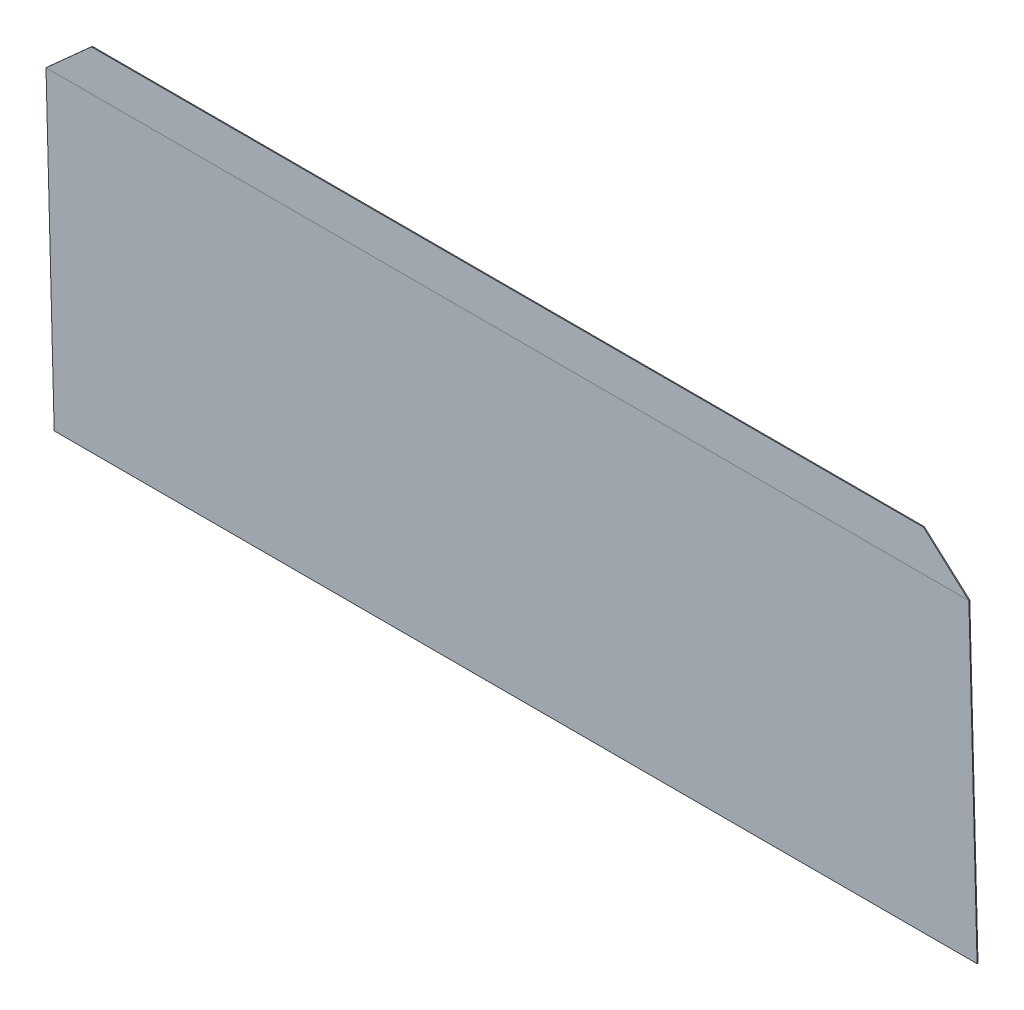
ISO-10303-21;
HEADER;
FILE_DESCRIPTION(('STEP AP214'),'2;1');
FILE_NAME('part.step','',(''),(''),'','','');
FILE_SCHEMA(('AUTOMOTIVE_DESIGN { 1 0 10303 214 1 1 1 1 }'));
ENDSEC;
DATA;
#1=APPLICATION_CONTEXT('core data for automotive mechanical design processes');
#2=APPLICATION_PROTOCOL_DEFINITION('international standard','automotive_design',2000,#1);
#3=PRODUCT_CONTEXT('',#1,'mechanical');
#4=PRODUCT('Part','Part','',(#3));
#5=PRODUCT_RELATED_PRODUCT_CATEGORY('part','',(#4));
#6=PRODUCT_DEFINITION_FORMATION('','',#4);
#7=PRODUCT_DEFINITION_CONTEXT('part definition',#1,'design');
#8=PRODUCT_DEFINITION('design','',#6,#7);
#9=PRODUCT_DEFINITION_SHAPE('','',#8);
#10=(LENGTH_UNIT() NAMED_UNIT(*) SI_UNIT(.MILLI.,.METRE.));
#11=(NAMED_UNIT(*) PLANE_ANGLE_UNIT() SI_UNIT($,.RADIAN.));
#12=(NAMED_UNIT(*) SI_UNIT($,.STERADIAN.) SOLID_ANGLE_UNIT());
#13=UNCERTAINTY_MEASURE_WITH_UNIT(LENGTH_MEASURE(1.E-05),#10,'distance_accuracy_value','');
#14=(GEOMETRIC_REPRESENTATION_CONTEXT(3) GLOBAL_UNCERTAINTY_ASSIGNED_CONTEXT((#13)) GLOBAL_UNIT_ASSIGNED_CONTEXT((#10,
#11,#12)) REPRESENTATION_CONTEXT('',''));
#15=CARTESIAN_POINT('',(0.,0.,0.));
#16=DIRECTION('',(0.,0.,1.));
#17=DIRECTION('',(1.,0.,0.));
#18=AXIS2_PLACEMENT_3D('',#15,#16,#17);
#19=CARTESIAN_POINT('',(996.,147.822198249311,3.36511894805777));
#20=DIRECTION('',(-1.,0.,0.));
#21=DIRECTION('',(0.,0.,1.));
#22=AXIS2_PLACEMENT_3D('',#19,#20,#21);
#23=CYLINDRICAL_SURFACE('',#22,1.);
#24=DIRECTION('',(-1.,0.,0.));
#25=VECTOR('',#24,1.);
#26=CARTESIAN_POINT('',(996.,147.79649246084,4.36478849967924));
#27=LINE('',#26,#25);
#28=CARTESIAN_POINT('',(996.,147.79649246084,4.36478849967927));
#29=VERTEX_POINT('',#28);
#30=CARTESIAN_POINT('',(0.,147.79649246084,4.36478849967924));
#31=VERTEX_POINT('',#30);
#32=EDGE_CURVE('E118',#29,#31,#27,.T.);
#33=ORIENTED_EDGE('',*,*,#32,.T.);
#34=CARTESIAN_POINT('',(-1.11022302462516E-13,147.79649246084,4.36478849967927));
#35=CARTESIAN_POINT('',(0.00238577729265074,147.79756329938,4.36481603553381));
#36=CARTESIAN_POINT('',(0.00477155458541177,147.798634182164,4.36484185076448));
#37=CARTESIAN_POINT('',(0.00954310917089681,147.800776025162,4.36489003973951));
#38=CARTESIAN_POINT('',(0.0119288864636208,147.801846985375,4.36491241348386));
#39=CARTESIAN_POINT('',(0.0167004410490676,147.803988972172,4.36495371924769));
#40=CARTESIAN_POINT('',(0.0190862183417904,147.805059998755,4.36497265126716));
#41=CARTESIAN_POINT('',(0.023857772927237,147.807202107231,4.36500707338775));
#42=CARTESIAN_POINT('',(0.0262435502199609,147.808273189123,4.36502256348887));
#43=CARTESIAN_POINT('',(0.0310151048054457,147.810415397156,4.3650501016121));
#44=CARTESIAN_POINT('',(0.0334008820982066,147.811486523296,4.36506214963422));
#45=CARTESIAN_POINT('',(0.038172436683693,147.813628808763,4.36508280347572));
#46=CARTESIAN_POINT('',(0.0405582139764185,147.81469996809,4.3650914092951));
#47=CARTESIAN_POINT('',(0.0453297685618653,147.816842308868,4.36510517864021));
#48=CARTESIAN_POINT('',(0.0477155458545867,147.817913490319,4.36511034216593));
#49=CARTESIAN_POINT('',(0.0524871004400665,147.820055864284,4.3651172268779));
#50=CARTESIAN_POINT('',(0.0548728777328248,147.821127056797,4.36511894806415));
#51=CARTESIAN_POINT('',(0.0572586550255938,147.822198249311,4.36511894805777));
#52=B_SPLINE_CURVE_WITH_KNOTS('',3,(#34,#35,#36,#37,#38,#39,#40,#41,#42,#43,#44,#45,#46,#47,#48,
#49,#50,#51),.UNSPECIFIED.,.F.,.F.,(4,2,2,2,2,2,2,2,4),(0.,0.00784566576759489,
0.0156913315350768,0.0235369973025671,0.0313826630700529,0.0392283288376536,0.0470739946051322,
0.0549196603726246,0.0627653261402175),.UNSPECIFIED.);
#53=CARTESIAN_POINT('',(0.0572559938601946,147.822198249311,4.3651189480578));
#54=VERTEX_POINT('',#53);
#55=EDGE_CURVE('E90',#31,#54,#52,.T.);
#56=ORIENTED_EDGE('',*,*,#55,.T.);
#57=DIRECTION('',(-1.,0.,0.));
#58=VECTOR('',#57,1.);
#59=CARTESIAN_POINT('',(996.,147.822198249311,4.3651189480578));
#60=LINE('',#59,#58);
#61=CARTESIAN_POINT('',(995.942745779997,147.822198249311,4.36511894805774));
#62=VERTEX_POINT('',#61);
#63=EDGE_CURVE('E47',#62,#54,#60,.T.);
#64=ORIENTED_EDGE('',*,*,#63,.F.);
#65=CARTESIAN_POINT('',(995.942745631178,147.822198249311,4.36511894805777));
#66=CARTESIAN_POINT('',(995.945131229879,147.821127056797,4.36511894806415));
#67=CARTESIAN_POINT('',(995.94751682858,147.820055864284,4.3651172268779));
#68=CARTESIAN_POINT('',(995.952288025982,147.817913490319,4.36511034216593));
#69=CARTESIAN_POINT('',(995.954673624683,147.816842308868,4.36510517864021));
#70=CARTESIAN_POINT('',(995.959444822084,147.81469996809,4.3650914092951));
#71=CARTESIAN_POINT('',(995.961830420785,147.813628808763,4.36508280347572));
#72=CARTESIAN_POINT('',(995.966601618187,147.811486523296,4.36506214963422));
#73=CARTESIAN_POINT('',(995.968987216888,147.810415397156,4.3650501016121));
#74=CARTESIAN_POINT('',(995.97375841429,147.808273189123,4.36502256348887));
#75=CARTESIAN_POINT('',(995.976144012991,147.807202107231,4.36500707338775));
#76=CARTESIAN_POINT('',(995.980915210393,147.805059998755,4.36497265126716));
#77=CARTESIAN_POINT('',(995.983300809094,147.803988972172,4.36495371924769));
#78=CARTESIAN_POINT('',(995.988072006495,147.801846985375,4.36491241348386));
#79=CARTESIAN_POINT('',(995.990457605196,147.800776025162,4.36489003973951));
#80=CARTESIAN_POINT('',(995.995228802598,147.798634182164,4.36484185076448));
#81=CARTESIAN_POINT('',(995.997614401299,147.79756329938,4.36481603553381));
#82=CARTESIAN_POINT('',(996.,147.79649246084,4.36478849967927));
#83=B_SPLINE_CURVE_WITH_KNOTS('',3,(#65,#66,#67,#68,#69,#70,#71,#72,#73,#74,#75,#76,#77,#78,#79,
#80,#81,#82),.UNSPECIFIED.,.F.,.F.,(4,2,2,2,2,2,2,2,4),(0.,0.00784517700101155,
0.0156903540021252,0.0235355310031238,0.0313807080041432,0.0392258850051489,0.0470710620061593,
0.0549162390072624,0.062761416008276),.UNSPECIFIED.);
#84=EDGE_CURVE('E125',#62,#29,#83,.T.);
#85=ORIENTED_EDGE('',*,*,#84,.T.);
#86=EDGE_LOOP('',(#33,#56,#64,#85));
#87=FACE_BOUND('',#86,.T.);
#88=ADVANCED_FACE('F44',(#87),#23,.F.);
#89=CARTESIAN_POINT('',(996.,191.809343231118,4.3651189480578));
#90=DIRECTION('',(0.,0.,-1.));
#91=DIRECTION('',(0.,1.,0.));
#92=AXIS2_PLACEMENT_3D('',#89,#90,#91);
#93=PLANE('',#92);
#94=DIRECTION('',(0.743951647274594,0.668233452108931,0.));
#95=VECTOR('',#94,1.);
#96=CARTESIAN_POINT('',(573.143242077711,662.580419753339,4.3651189480577));
#97=LINE('',#96,#95);
#98=CARTESIAN_POINT('',(48.9999999999997,191.783628945404,4.3651189480578));
#99=VERTEX_POINT('',#98);
#100=EDGE_CURVE('E276',#54,#99,#97,.T.);
#101=ORIENTED_EDGE('',*,*,#100,.T.);
#102=DIRECTION('',(0.,1.,0.));
#103=VECTOR('',#102,1.);
#104=CARTESIAN_POINT('',(48.9999999999995,147.805230559897,4.36511894805774));
#105=LINE('',#104,#103);
#106=CARTESIAN_POINT('',(48.9999999999997,191.809343231118,4.3651189480578));
#107=VERTEX_POINT('',#106);
#108=EDGE_CURVE('E328',#107,#99,#105,.F.);
#109=ORIENTED_EDGE('',*,*,#108,.F.);
#110=DIRECTION('',(-1.,0.,0.));
#111=VECTOR('',#110,1.);
#112=CARTESIAN_POINT('',(996.,191.809343231118,4.3651189480578));
#113=LINE('',#112,#111);
#114=CARTESIAN_POINT('',(947.,191.809343231118,4.36511894805774));
#115=VERTEX_POINT('',#114);
#116=EDGE_CURVE('E148',#115,#107,#113,.T.);
#117=ORIENTED_EDGE('',*,*,#116,.F.);
#118=DIRECTION('',(0.743951647274595,-0.668233452108929,0.));
#119=VECTOR('',#118,1.);
#120=CARTESIAN_POINT('',(974.119738620647,167.449807735557,4.36511894805774));
#121=LINE('',#120,#119);
#122=CARTESIAN_POINT('',(947.02862799693,191.783628945404,4.36511894805774));
#123=VERTEX_POINT('',#122);
#124=EDGE_CURVE('E305',#115,#123,#121,.T.);
#125=ORIENTED_EDGE('',*,*,#124,.T.);
#126=DIRECTION('',(1.,0.,0.));
#127=VECTOR('',#126,1.);
#128=CARTESIAN_POINT('',(996.,191.783628945404,4.36511894805774));
#129=LINE('',#128,#127);
#130=CARTESIAN_POINT('',(947.,191.783628945404,4.36511894805774));
#131=VERTEX_POINT('',#130);
#132=EDGE_CURVE('E314',#123,#131,#129,.F.);
#133=ORIENTED_EDGE('',*,*,#132,.T.);
#134=DIRECTION('',(0.743951647274595,-0.668233452108929,0.));
#135=VECTOR('',#134,1.);
#136=CARTESIAN_POINT('',(974.10695519094,167.435575802753,4.36511894805774));
#137=LINE('',#136,#135);
#138=EDGE_CURVE('E180',#131,#62,#137,.T.);
#139=ORIENTED_EDGE('',*,*,#138,.T.);
#140=ORIENTED_EDGE('',*,*,#63,.T.);
#141=EDGE_LOOP('',(#101,#109,#117,#125,#133,#139,#140));
#142=FACE_BOUND('',#141,.T.);
#143=ADVANCED_FACE('F213',(#142),#93,.T.);
#144=CARTESIAN_POINT('',(996.,191.809343231118,5.3651189480578));
#145=DIRECTION('',(0.,1.,0.));
#146=DIRECTION('',(0.,0.,1.));
#147=AXIS2_PLACEMENT_3D('',#144,#145,#146);
#148=PLANE('',#147);
#149=ORIENTED_EDGE('',*,*,#116,.T.);
#150=DIRECTION('',(0.,0.,-1.));
#151=VECTOR('',#150,1.);
#152=CARTESIAN_POINT('',(49.,191.809343231118,4.36511894806097));
#153=LINE('',#152,#151);
#154=CARTESIAN_POINT('',(48.9999999999997,191.809343231118,5.3651189480578));
#155=VERTEX_POINT('',#154);
#156=EDGE_CURVE('E326',#107,#155,#153,.F.);
#157=ORIENTED_EDGE('',*,*,#156,.T.);
#158=DIRECTION('',(-1.,0.,0.));
#159=VECTOR('',#158,1.);
#160=CARTESIAN_POINT('',(996.,191.809343231118,5.3651189480578));
#161=LINE('',#160,#159);
#162=CARTESIAN_POINT('',(947.,191.809343231118,5.36511894805774));
#163=VERTEX_POINT('',#162);
#164=EDGE_CURVE('E146',#163,#155,#161,.T.);
#165=ORIENTED_EDGE('',*,*,#164,.F.);
#166=DIRECTION('',(0.,0.,-1.));
#167=VECTOR('',#166,1.);
#168=CARTESIAN_POINT('',(947.,191.809343231118,4.36511894805719));
#169=LINE('',#168,#167);
#170=EDGE_CURVE('E304',#115,#163,#169,.F.);
#171=ORIENTED_EDGE('',*,*,#170,.F.);
#172=EDGE_LOOP('',(#149,#157,#165,#171));
#173=FACE_BOUND('',#172,.T.);
#174=ADVANCED_FACE('F214',(#173),#148,.T.);
#175=CARTESIAN_POINT('',(996.,191.809343231118,5.3651189480578));
#176=DIRECTION('',(0.,0.,-1.));
#177=DIRECTION('',(0.,1.,0.));
#178=AXIS2_PLACEMENT_3D('',#175,#176,#177);
#179=PLANE('',#178);
#180=DIRECTION('',(0.,-1.,0.));
#181=VECTOR('',#180,1.);
#182=CARTESIAN_POINT('',(48.9999999999997,191.809343231118,5.36511894805738));
#183=LINE('',#182,#181);
#184=CARTESIAN_POINT('',(48.9999999999999,191.783628945404,5.3651189480578));
#185=VERTEX_POINT('',#184);
#186=EDGE_CURVE('E270',#155,#185,#183,.T.);
#187=ORIENTED_EDGE('',*,*,#186,.T.);
#188=DIRECTION('',(0.743951647274594,0.668233452108931,0.));
#189=VECTOR('',#188,1.);
#190=CARTESIAN_POINT('',(573.143242077711,662.580419753339,5.3651189480577));
#191=LINE('',#190,#189);
#192=CARTESIAN_POINT('',(0.0572559938600836,147.822198249311,5.36511894805777));
#193=VERTEX_POINT('',#192);
#194=EDGE_CURVE('E274',#193,#185,#191,.T.);
#195=ORIENTED_EDGE('',*,*,#194,.F.);
#196=DIRECTION('',(-1.,0.,0.));
#197=VECTOR('',#196,1.);
#198=CARTESIAN_POINT('',(996.,147.822198249311,5.36511894805777));
#199=LINE('',#198,#197);
#200=CARTESIAN_POINT('',(995.942785784846,147.822190933463,5.36511894805777));
#201=VERTEX_POINT('',#200);
#202=EDGE_CURVE('E137',#201,#193,#199,.T.);
#203=ORIENTED_EDGE('',*,*,#202,.F.);
#204=DIRECTION('',(0.743951647274595,-0.668233452108929,0.));
#205=VECTOR('',#204,1.);
#206=CARTESIAN_POINT('',(974.10695519094,167.435575802753,5.36511894805774));
#207=LINE('',#206,#205);
#208=CARTESIAN_POINT('',(947.,191.783628945404,5.36511894805774));
#209=VERTEX_POINT('',#208);
#210=EDGE_CURVE('E65',#209,#201,#207,.T.);
#211=ORIENTED_EDGE('',*,*,#210,.F.);
#212=DIRECTION('',(-1.,0.,0.));
#213=VECTOR('',#212,1.);
#214=CARTESIAN_POINT('',(996.,191.783628945404,5.36511894805774));
#215=LINE('',#214,#213);
#216=CARTESIAN_POINT('',(947.02862799693,191.783628945404,5.36511894805774));
#217=VERTEX_POINT('',#216);
#218=EDGE_CURVE('E309',#217,#209,#215,.T.);
#219=ORIENTED_EDGE('',*,*,#218,.F.);
#220=DIRECTION('',(0.743951647274595,-0.668233452108929,0.));
#221=VECTOR('',#220,1.);
#222=CARTESIAN_POINT('',(974.119738620647,167.449807735557,5.36511894805774));
#223=LINE('',#222,#221);
#224=EDGE_CURVE('E310',#163,#217,#223,.T.);
#225=ORIENTED_EDGE('',*,*,#224,.F.);
#226=ORIENTED_EDGE('',*,*,#164,.T.);
#227=EDGE_LOOP('',(#187,#195,#203,#211,#219,#225,#226));
#228=FACE_BOUND('',#227,.T.);
#229=ADVANCED_FACE('F210',(#228),#179,.F.);
#230=CARTESIAN_POINT('',(996.,147.822198249311,3.36511894805777));
#231=DIRECTION('',(-1.,0.,0.));
#232=DIRECTION('',(0.,0.,1.));
#233=AXIS2_PLACEMENT_3D('',#230,#231,#232);
#234=CYLINDRICAL_SURFACE('',#233,2.);
#235=CARTESIAN_POINT('',(-1.11022302462516E-13,147.77078667237,5.36445805130076));
#236=CARTESIAN_POINT('',(0.00238577729267448,147.772928349449,5.36451312300984));
#237=CARTESIAN_POINT('',(0.00477155458542818,147.775070115017,5.36456475347119));
#238=CARTESIAN_POINT('',(0.00954310917089858,147.779353801012,5.36466113142124));
#239=CARTESIAN_POINT('',(0.0119288864636153,147.78149572144,5.36470587890996));
#240=CARTESIAN_POINT('',(0.0167004410490636,147.785779695033,5.36478849043761));
#241=CARTESIAN_POINT('',(0.0190862183417953,147.7879217482,5.36482635447654));
#242=CARTESIAN_POINT('',(0.023857772927239,147.792205965151,5.36489519871772));
#243=CARTESIAN_POINT('',(0.026243550219951,147.794348128935,5.36492617891996));
#244=CARTESIAN_POINT('',(0.0310151048054384,147.798632545001,5.36498125516644));
#245=CARTESIAN_POINT('',(0.0334008820982137,147.800774797282,5.36500535121067));
#246=CARTESIAN_POINT('',(0.0381724366837041,147.805059368216,5.36504665889367));
#247=CARTESIAN_POINT('',(0.0405582139764192,147.807201686869,5.36506387053244));
#248=CARTESIAN_POINT('',(0.0453297685618578,147.811486368425,5.36509140922264));
#249=CARTESIAN_POINT('',(0.0477155458545814,147.813628731327,5.36510173627408));
#250=CARTESIAN_POINT('',(0.0524871004400656,147.817913479257,5.36511550569803));
#251=CARTESIAN_POINT('',(0.0548728777328263,147.820055864284,5.36511894807053));
#252=CARTESIAN_POINT('',(0.0572586550255938,147.822198249311,5.36511894805777));
#253=B_SPLINE_CURVE_WITH_KNOTS('',3,(#235,#236,#237,#238,#239,#240,#241,#242,#243,#244,#245,
#246,#247,#248,#249,#250,#251,#252),.UNSPECIFIED.,.F.,.F.,(4,2,2,2,2,2,2,2,4),(0.,
0.00961954710468473,0.0192390942093042,0.0288586413138957,0.0384781884185094,0.0480977355231944,
0.0577172826278034,0.0673368297324015,0.0769563768370981),.UNSPECIFIED.);
#254=CARTESIAN_POINT('',(0.,147.77078667237,5.36445805130076));
#255=VERTEX_POINT('',#254);
#256=EDGE_CURVE('E102',#255,#193,#253,.T.);
#257=ORIENTED_EDGE('',*,*,#256,.F.);
#258=DIRECTION('',(-1.,0.,0.));
#259=VECTOR('',#258,1.);
#260=CARTESIAN_POINT('',(996.,147.77078667237,5.36445805130073));
#261=LINE('',#260,#259);
#262=CARTESIAN_POINT('',(996.,147.77078667237,5.36445805130076));
#263=VERTEX_POINT('',#262);
#264=EDGE_CURVE('E136',#263,#255,#261,.T.);
#265=ORIENTED_EDGE('',*,*,#264,.F.);
#266=CARTESIAN_POINT('',(995.942745631178,147.822198249311,5.36511894805777));
#267=CARTESIAN_POINT('',(995.945131229879,147.820055864284,5.36511894807053));
#268=CARTESIAN_POINT('',(995.94751682858,147.817913479257,5.36511550569802));
#269=CARTESIAN_POINT('',(995.952288025982,147.813628731327,5.36510173627408));
#270=CARTESIAN_POINT('',(995.954673624683,147.811486368425,5.36509140922264));
#271=CARTESIAN_POINT('',(995.959444822084,147.807201686869,5.36506387053244));
#272=CARTESIAN_POINT('',(995.961830420785,147.805059368216,5.36504665889367));
#273=CARTESIAN_POINT('',(995.966601618187,147.800774797282,5.36500535121067));
#274=CARTESIAN_POINT('',(995.968987216888,147.798632545001,5.36498125516644));
#275=CARTESIAN_POINT('',(995.97375841429,147.794348128935,5.36492617891996));
#276=CARTESIAN_POINT('',(995.976144012991,147.792205965151,5.36489519871772));
#277=CARTESIAN_POINT('',(995.980915210393,147.7879217482,5.36482635447654));
#278=CARTESIAN_POINT('',(995.983300809094,147.785779695033,5.36478849043761));
#279=CARTESIAN_POINT('',(995.988072006495,147.78149572144,5.36470587890996));
#280=CARTESIAN_POINT('',(995.990457605196,147.779353801012,5.36466113142124));
#281=CARTESIAN_POINT('',(995.995228802598,147.775070115017,5.36456475347119));
#282=CARTESIAN_POINT('',(995.997614401299,147.772928349449,5.36451312300985));
#283=CARTESIAN_POINT('',(996.,147.77078667237,5.36445805130076));
#284=B_SPLINE_CURVE_WITH_KNOTS('',3,(#266,#267,#268,#269,#270,#271,#272,#273,#274,#275,#276,
#277,#278,#279,#280,#281,#282,#283),.UNSPECIFIED.,.F.,.F.,(4,2,2,2,2,2,2,2,4),(0.,
0.00961914847270273,0.0192382969454721,0.0288574454181699,0.0384765938908609,0.0480957423635634,
0.0577148908362435,0.0673340393090344,0.0769531877817252),.UNSPECIFIED.);
#285=EDGE_CURVE('E173',#201,#263,#284,.T.);
#286=ORIENTED_EDGE('',*,*,#285,.F.);
#287=ORIENTED_EDGE('',*,*,#202,.T.);
#288=EDGE_LOOP('',(#257,#265,#286,#287));
#289=FACE_BOUND('',#288,.T.);
#290=ADVANCED_FACE('F202',(#289),#234,.T.);
#291=CARTESIAN_POINT('',(996.,147.822198249311,5.36511894805777));
#292=DIRECTION('',(1.,0.,0.));
#293=DIRECTION('',(0.,0.,-1.));
#294=AXIS2_PLACEMENT_3D('',#291,#292,#293);
#295=PLANE('',#294);
#296=DIRECTION('',(0.,-0.999669551621495,-0.0257057884702679));
#297=VECTOR('',#296,1.);
#298=CARTESIAN_POINT('',(996.,147.809343231118,4.3651189480578));
#299=LINE('',#298,#297);
#300=CARTESIAN_POINT('',(996.,-196.076982526676,-4.47767228571437));
#301=VERTEX_POINT('',#300);
#302=EDGE_CURVE('E139',#29,#301,#299,.T.);
#303=ORIENTED_EDGE('',*,*,#302,.F.);
#304=DIRECTION('',(0.,-0.025705788470276,0.999669551621495));
#305=VECTOR('',#304,1.);
#306=CARTESIAN_POINT('',(996.,147.79649246084,4.36478849967924));
#307=LINE('',#306,#305);
#308=EDGE_CURVE('E11',#29,#263,#307,.T.);
#309=ORIENTED_EDGE('',*,*,#308,.T.);
#310=DIRECTION('',(0.,-0.999669551621496,-0.0257057884702679));
#311=VECTOR('',#310,1.);
#312=CARTESIAN_POINT('',(996.,147.783637442648,5.3647884996793));
#313=LINE('',#312,#311);
#314=CARTESIAN_POINT('',(996.,-196.102688315147,-3.47800273409288));
#315=VERTEX_POINT('',#314);
#316=EDGE_CURVE('E130',#263,#315,#313,.T.);
#317=ORIENTED_EDGE('',*,*,#316,.T.);
#318=DIRECTION('',(0.,-0.025705788470387,0.999669551621492));
#319=VECTOR('',#318,1.);
#320=CARTESIAN_POINT('',(996.,-196.076982526676,-4.47767228571437));
#321=LINE('',#320,#319);
#322=EDGE_CURVE('E131',#301,#315,#321,.T.);
#323=ORIENTED_EDGE('',*,*,#322,.F.);
#324=EDGE_LOOP('',(#303,#309,#317,#323));
#325=FACE_BOUND('',#324,.T.);
#326=ADVANCED_FACE('F50',(#325),#295,.T.);
#327=CARTESIAN_POINT('',(996.,147.783637442648,5.3647884996793));
#328=DIRECTION('',(0.,0.0257057884702679,-0.999669551621495));
#329=DIRECTION('',(0.,0.999669551621496,0.0257057884702679));
#330=AXIS2_PLACEMENT_3D('',#327,#328,#329);
#331=PLANE('',#330);
#332=DIRECTION('',(0.,-0.999669551621496,-0.0257057884702679));
#333=VECTOR('',#332,1.);
#334=CARTESIAN_POINT('',(0.,147.783637442648,5.3647884996793));
#335=LINE('',#334,#333);
#336=CARTESIAN_POINT('',(0.,-196.102688315147,-3.47800273409288));
#337=VERTEX_POINT('',#336);
#338=EDGE_CURVE('E104',#255,#337,#335,.T.);
#339=ORIENTED_EDGE('',*,*,#338,.T.);
#340=DIRECTION('',(-1.,0.,0.));
#341=VECTOR('',#340,1.);
#342=CARTESIAN_POINT('',(996.,-196.102688315147,-3.47800273409288));
#343=LINE('',#342,#341);
#344=EDGE_CURVE('E114',#315,#337,#343,.T.);
#345=ORIENTED_EDGE('',*,*,#344,.F.);
#346=ORIENTED_EDGE('',*,*,#316,.F.);
#347=ORIENTED_EDGE('',*,*,#264,.T.);
#348=EDGE_LOOP('',(#339,#345,#346,#347));
#349=FACE_BOUND('',#348,.T.);
#350=ADVANCED_FACE('F166',(#349),#331,.F.);
#351=CARTESIAN_POINT('',(996.,-196.076982526676,-4.47767228571437));
#352=DIRECTION('',(0.,-0.999669551621492,-0.025705788470387));
#353=DIRECTION('',(0.,0.025705788470387,-0.999669551621493));
#354=AXIS2_PLACEMENT_3D('',#351,#352,#353);
#355=PLANE('',#354);
#356=DIRECTION('',(0.,-0.025705788470387,0.999669551621492));
#357=VECTOR('',#356,1.);
#358=CARTESIAN_POINT('',(0.,-196.076982526676,-4.47767228571437));
#359=LINE('',#358,#357);
#360=CARTESIAN_POINT('',(0.,-196.076982526676,-4.47767228571437));
#361=VERTEX_POINT('',#360);
#362=EDGE_CURVE('E128',#361,#337,#359,.T.);
#363=ORIENTED_EDGE('',*,*,#362,.F.);
#364=DIRECTION('',(-1.,0.,0.));
#365=VECTOR('',#364,1.);
#366=CARTESIAN_POINT('',(996.,-196.076982526676,-4.47767228571437));
#367=LINE('',#366,#365);
#368=EDGE_CURVE('E75',#301,#361,#367,.T.);
#369=ORIENTED_EDGE('',*,*,#368,.F.);
#370=ORIENTED_EDGE('',*,*,#322,.T.);
#371=ORIENTED_EDGE('',*,*,#344,.T.);
#372=EDGE_LOOP('',(#363,#369,#370,#371));
#373=FACE_BOUND('',#372,.T.);
#374=ADVANCED_FACE('F164',(#373),#355,.T.);
#375=CARTESIAN_POINT('',(996.,147.809343231118,4.3651189480578));
#376=DIRECTION('',(0.,0.0257057884702679,-0.999669551621495));
#377=DIRECTION('',(0.,0.999669551621496,0.0257057884702679));
#378=AXIS2_PLACEMENT_3D('',#375,#376,#377);
#379=PLANE('',#378);
#380=DIRECTION('',(0.,-0.999669551621495,-0.0257057884702679));
#381=VECTOR('',#380,1.);
#382=CARTESIAN_POINT('',(0.,147.809343231118,4.3651189480578));
#383=LINE('',#382,#381);
#384=EDGE_CURVE('E113',#31,#361,#383,.T.);
#385=ORIENTED_EDGE('',*,*,#384,.F.);
#386=ORIENTED_EDGE('',*,*,#32,.F.);
#387=ORIENTED_EDGE('',*,*,#302,.T.);
#388=ORIENTED_EDGE('',*,*,#368,.T.);
#389=EDGE_LOOP('',(#385,#386,#387,#388));
#390=FACE_BOUND('',#389,.T.);
#391=ADVANCED_FACE('F126',(#390),#379,.T.);
#392=CARTESIAN_POINT('',(0.,147.822198249311,3.36511894805777));
#393=DIRECTION('',(-1.,0.,0.));
#394=DIRECTION('',(0.,-1.,0.));
#395=AXIS2_PLACEMENT_3D('',#392,#393,#394);
#396=PLANE('',#395);
#397=ORIENTED_EDGE('',*,*,#338,.F.);
#398=DIRECTION('',(0.,0.025705788470276,-0.999669551621495));
#399=VECTOR('',#398,1.);
#400=CARTESIAN_POINT('',(0.,147.77078667237,5.36445805130073));
#401=LINE('',#400,#399);
#402=EDGE_CURVE('E54',#255,#31,#401,.T.);
#403=ORIENTED_EDGE('',*,*,#402,.T.);
#404=ORIENTED_EDGE('',*,*,#384,.T.);
#405=ORIENTED_EDGE('',*,*,#362,.T.);
#406=EDGE_LOOP('',(#397,#403,#404,#405));
#407=FACE_BOUND('',#406,.T.);
#408=ADVANCED_FACE('F109',(#407),#396,.T.);
#409=CARTESIAN_POINT('',(-1.11022302462516E-13,147.77078667237,5.36445805130073));
#410=CARTESIAN_POINT('',(0.0190859848694829,147.787920089108,5.364898624874));
#411=CARTESIAN_POINT('',(0.0381722029825374,147.805059168994,5.36511894805774));
#412=CARTESIAN_POINT('',(0.0572586550255938,147.822198249311,5.36511894805774));
#413=CARTESIAN_POINT('',(-1.11022302462516E-13,147.79649246084,4.36478849967924));
#414=CARTESIAN_POINT('',(0.0190859847980833,147.805059169177,4.36500878646505));
#415=CARTESIAN_POINT('',(0.0381722030539108,147.813628709184,4.36511894805774));
#416=CARTESIAN_POINT('',(0.0572586550255938,147.822198249311,4.36511894805774));
#417=B_SPLINE_SURFACE_WITH_KNOTS('',1,3,((#409,#410,#411,#412),(#413,#414,#415,#416)),
.UNSPECIFIED.,.F.,.F.,.F.,(2,2),(4,4),(0.,1.),(0.,1.),.UNSPECIFIED.);
#418=CARTESIAN_POINT('',(0.0572586550255938,147.822198249311,5.36511894805774));
#419=CARTESIAN_POINT('',(0.0572586550255938,147.822198249311,4.36511894805774));
#420=B_SPLINE_CURVE_WITH_KNOTS('',1,(#418,#419),.UNSPECIFIED.,.F.,.F.,(2,2),(0.,1.),.UNSPECIFIED.);
#421=EDGE_CURVE('E97',#193,#54,#420,.T.);
#422=ORIENTED_EDGE('',*,*,#402,.F.);
#423=ORIENTED_EDGE('',*,*,#256,.T.);
#424=ORIENTED_EDGE('',*,*,#421,.T.);
#425=ORIENTED_EDGE('',*,*,#55,.F.);
#426=EDGE_LOOP('',(#422,#423,#424,#425));
#427=FACE_BOUND('',#426,.T.);
#428=ADVANCED_FACE('F92',(#427),#417,.F.);
#429=CARTESIAN_POINT('',(48.9999999999997,191.809343231118,5.36511894805738));
#430=DIRECTION('',(1.,0.,0.));
#431=DIRECTION('',(0.,-1.,0.));
#432=AXIS2_PLACEMENT_3D('',#429,#430,#431);
#433=PLANE('',#432);
#434=ORIENTED_EDGE('',*,*,#156,.F.);
#435=ORIENTED_EDGE('',*,*,#108,.T.);
#436=DIRECTION('',(0.,0.,1.));
#437=VECTOR('',#436,1.);
#438=CARTESIAN_POINT('',(48.9999999999999,191.783628945404,5.36511894805774));
#439=LINE('',#438,#437);
#440=EDGE_CURVE('E277',#185,#99,#439,.F.);
#441=ORIENTED_EDGE('',*,*,#440,.F.);
#442=ORIENTED_EDGE('',*,*,#186,.F.);
#443=EDGE_LOOP('',(#434,#435,#441,#442));
#444=FACE_BOUND('',#443,.T.);
#445=ADVANCED_FACE('F373',(#444),#433,.F.);
#446=CARTESIAN_POINT('',(573.143242077711,662.580419753339,5.3651189480577));
#447=DIRECTION('',(-0.668233452108931,0.743951647274594,0.));
#448=DIRECTION('',(0.743951647274594,0.668233452108931,0.));
#449=AXIS2_PLACEMENT_3D('',#446,#447,#448);
#450=PLANE('',#449);
#451=ORIENTED_EDGE('',*,*,#421,.F.);
#452=ORIENTED_EDGE('',*,*,#194,.T.);
#453=ORIENTED_EDGE('',*,*,#440,.T.);
#454=ORIENTED_EDGE('',*,*,#100,.F.);
#455=EDGE_LOOP('',(#451,#452,#453,#454));
#456=FACE_BOUND('',#455,.T.);
#457=ADVANCED_FACE('F275',(#456),#450,.T.);
#458=CARTESIAN_POINT('',(995.942745631178,147.822197586453,5.36511894805763));
#459=CARTESIAN_POINT('',(995.961830187333,147.805058727087,5.36511894237732));
#460=CARTESIAN_POINT('',(995.980914976714,147.787919868225,5.36489861919414));
#461=CARTESIAN_POINT('',(996.,147.77078667237,5.36445805130073));
#462=CARTESIAN_POINT('',(995.942745631178,147.822197917882,4.36511894805769));
#463=CARTESIAN_POINT('',(995.961830187262,147.813628488231,4.36511894521753));
#464=CARTESIAN_POINT('',(995.980914976785,147.805059058736,4.36500878362512));
#465=CARTESIAN_POINT('',(996.,147.79649246084,4.36478849967924));
#466=B_SPLINE_SURFACE_WITH_KNOTS('',1,3,((#458,#459,#460,#461),(#462,#463,#464,#465)),
.UNSPECIFIED.,.F.,.F.,.F.,(2,2),(4,4),(0.,1.),(1.28917432446241E-05,1.),.UNSPECIFIED.);
#467=CARTESIAN_POINT('',(995.942745631178,147.822197917882,4.36511894805769));
#468=CARTESIAN_POINT('',(995.942745631178,147.822197586453,5.36511894805763));
#469=B_SPLINE_CURVE_WITH_KNOTS('',1,(#467,#468),.UNSPECIFIED.,.F.,.F.,(2,2),(0.,1.),.UNSPECIFIED.);
#470=EDGE_CURVE('E282',#201,#62,#469,.F.);
#471=ORIENTED_EDGE('',*,*,#470,.F.);
#472=ORIENTED_EDGE('',*,*,#285,.T.);
#473=ORIENTED_EDGE('',*,*,#308,.F.);
#474=ORIENTED_EDGE('',*,*,#84,.F.);
#475=EDGE_LOOP('',(#471,#472,#473,#474));
#476=FACE_BOUND('',#475,.T.);
#477=ADVANCED_FACE('F192',(#476),#466,.F.);
#478=CARTESIAN_POINT('',(974.10695519094,167.435575802753,5.36511894805774));
#479=DIRECTION('',(0.668233452108929,0.743951647274596,0.));
#480=DIRECTION('',(0.743951647274595,-0.668233452108929,0.));
#481=AXIS2_PLACEMENT_3D('',#478,#479,#480);
#482=PLANE('',#481);
#483=ORIENTED_EDGE('',*,*,#210,.T.);
#484=ORIENTED_EDGE('',*,*,#470,.T.);
#485=ORIENTED_EDGE('',*,*,#138,.F.);
#486=DIRECTION('',(0.,0.,1.));
#487=VECTOR('',#486,1.);
#488=CARTESIAN_POINT('',(947.,191.783628945404,5.36511894805774));
#489=LINE('',#488,#487);
#490=EDGE_CURVE('E312',#209,#131,#489,.F.);
#491=ORIENTED_EDGE('',*,*,#490,.F.);
#492=EDGE_LOOP('',(#483,#484,#485,#491));
#493=FACE_BOUND('',#492,.T.);
#494=ADVANCED_FACE('F324',(#493),#482,.T.);
#495=CARTESIAN_POINT('',(996.,191.783628945404,5.36511894805774));
#496=DIRECTION('',(0.,-1.,0.));
#497=DIRECTION('',(-1.,0.,0.));
#498=AXIS2_PLACEMENT_3D('',#495,#496,#497);
#499=PLANE('',#498);
#500=ORIENTED_EDGE('',*,*,#218,.T.);
#501=ORIENTED_EDGE('',*,*,#490,.T.);
#502=ORIENTED_EDGE('',*,*,#132,.F.);
#503=DIRECTION('',(0.,0.,-1.));
#504=VECTOR('',#503,1.);
#505=CARTESIAN_POINT('',(947.02862799693,191.783628945404,4.36511894805774));
#506=LINE('',#505,#504);
#507=EDGE_CURVE('E294',#217,#123,#506,.T.);
#508=ORIENTED_EDGE('',*,*,#507,.F.);
#509=EDGE_LOOP('',(#500,#501,#502,#508));
#510=FACE_BOUND('',#509,.T.);
#511=ADVANCED_FACE('F323',(#510),#499,.T.);
#512=CARTESIAN_POINT('',(974.119738620647,167.449807735557,4.36511894805774));
#513=DIRECTION('',(0.668233452108929,0.743951647274596,0.));
#514=DIRECTION('',(0.743951647274595,-0.668233452108929,0.));
#515=AXIS2_PLACEMENT_3D('',#512,#513,#514);
#516=PLANE('',#515);
#517=ORIENTED_EDGE('',*,*,#507,.T.);
#518=ORIENTED_EDGE('',*,*,#124,.F.);
#519=ORIENTED_EDGE('',*,*,#170,.T.);
#520=ORIENTED_EDGE('',*,*,#224,.T.);
#521=EDGE_LOOP('',(#517,#518,#519,#520));
#522=FACE_BOUND('',#521,.T.);
#523=ADVANCED_FACE('F363',(#522),#516,.T.);
#524=CLOSED_SHELL('',(#88,#143,#174,#229,#290,#326,#350,#374,#391,#408,#428,#445,#457,#477,#494,
#511,#523));
#525=MANIFOLD_SOLID_BREP('B2',#524);
#526=ADVANCED_BREP_SHAPE_REPRESENTATION('',(#18,#525),#14);
#527=SHAPE_DEFINITION_REPRESENTATION(#9,#526);
ENDSEC;
END-ISO-10303-21;
